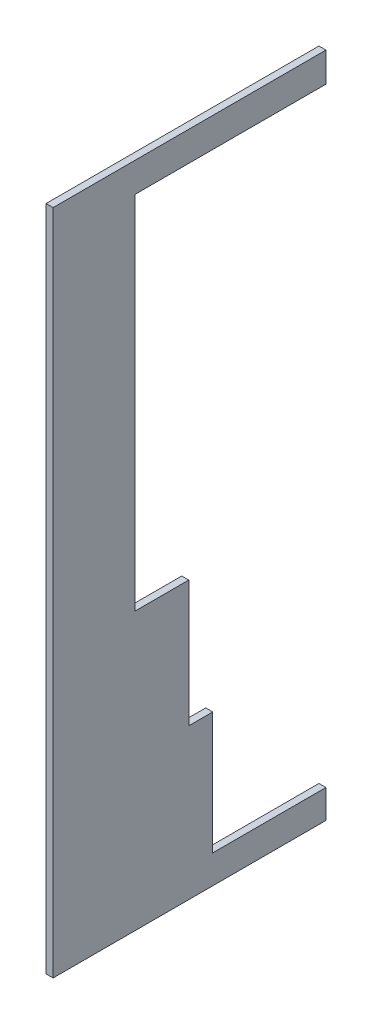
ISO-10303-21;
HEADER;
FILE_DESCRIPTION(('STEP AP214'),'2;1');
FILE_NAME('part.step','',(''),(''),'','','');
FILE_SCHEMA(('AUTOMOTIVE_DESIGN { 1 0 10303 214 1 1 1 1 }'));
ENDSEC;
DATA;
#1=APPLICATION_CONTEXT('core data for automotive mechanical design processes');
#2=APPLICATION_PROTOCOL_DEFINITION('international standard','automotive_design',2000,#1);
#3=PRODUCT_CONTEXT('',#1,'mechanical');
#4=PRODUCT('Part','Part','',(#3));
#5=PRODUCT_RELATED_PRODUCT_CATEGORY('part','',(#4));
#6=PRODUCT_DEFINITION_FORMATION('','',#4);
#7=PRODUCT_DEFINITION_CONTEXT('part definition',#1,'design');
#8=PRODUCT_DEFINITION('design','',#6,#7);
#9=PRODUCT_DEFINITION_SHAPE('','',#8);
#10=(LENGTH_UNIT() NAMED_UNIT(*) SI_UNIT(.MILLI.,.METRE.));
#11=(NAMED_UNIT(*) PLANE_ANGLE_UNIT() SI_UNIT($,.RADIAN.));
#12=(NAMED_UNIT(*) SI_UNIT($,.STERADIAN.) SOLID_ANGLE_UNIT());
#13=UNCERTAINTY_MEASURE_WITH_UNIT(LENGTH_MEASURE(1.E-05),#10,'distance_accuracy_value','');
#14=(GEOMETRIC_REPRESENTATION_CONTEXT(3) GLOBAL_UNCERTAINTY_ASSIGNED_CONTEXT((#13)) GLOBAL_UNIT_ASSIGNED_CONTEXT((#10,
#11,#12)) REPRESENTATION_CONTEXT('',''));
#15=CARTESIAN_POINT('',(0.,0.,0.));
#16=DIRECTION('',(0.,0.,1.));
#17=DIRECTION('',(1.,0.,0.));
#18=AXIS2_PLACEMENT_3D('',#15,#16,#17);
#19=CARTESIAN_POINT('',(1.,100.85,3.40000000000002));
#20=DIRECTION('',(0.,0.,-1.));
#21=DIRECTION('',(0.,1.,0.));
#22=AXIS2_PLACEMENT_3D('',#19,#20,#21);
#23=PLANE('',#22);
#24=DIRECTION('',(1.,0.,0.));
#25=VECTOR('',#24,1.);
#26=CARTESIAN_POINT('',(1.,96.6421958739952,3.40000000000002));
#27=LINE('',#26,#25);
#28=CARTESIAN_POINT('',(0.,96.6421958739952,3.40000000000002));
#29=VERTEX_POINT('',#28);
#30=CARTESIAN_POINT('',(1.,96.6421958739952,3.40000000000002));
#31=VERTEX_POINT('',#30);
#32=EDGE_CURVE('E182',#29,#31,#27,.T.);
#33=ORIENTED_EDGE('',*,*,#32,.F.);
#34=DIRECTION('',(0.,-1.,0.));
#35=VECTOR('',#34,1.);
#36=CARTESIAN_POINT('',(0.,5.85000000000011,3.40000000000002));
#37=LINE('',#36,#35);
#38=CARTESIAN_POINT('',(0.,100.85,3.40000000000002));
#39=VERTEX_POINT('',#38);
#40=EDGE_CURVE('E191',#39,#29,#37,.T.);
#41=ORIENTED_EDGE('',*,*,#40,.F.);
#42=DIRECTION('',(-1.,0.,0.));
#43=VECTOR('',#42,1.);
#44=CARTESIAN_POINT('',(1.,100.85,3.40000000000002));
#45=LINE('',#44,#43);
#46=CARTESIAN_POINT('',(1.,100.85,3.40000000000002));
#47=VERTEX_POINT('',#46);
#48=EDGE_CURVE('E211',#47,#39,#45,.T.);
#49=ORIENTED_EDGE('',*,*,#48,.F.);
#50=DIRECTION('',(0.,-1.,0.));
#51=VECTOR('',#50,1.);
#52=CARTESIAN_POINT('',(1.,100.85,3.40000000000002));
#53=LINE('',#52,#51);
#54=EDGE_CURVE('E206',#47,#31,#53,.T.);
#55=ORIENTED_EDGE('',*,*,#54,.T.);
#56=EDGE_LOOP('',(#33,#41,#49,#55));
#57=FACE_BOUND('',#56,.T.);
#58=ADVANCED_FACE('F34',(#57),#23,.T.);
#59=CARTESIAN_POINT('',(1.,5.85000000000011,3.40000000000003));
#60=DIRECTION('',(0.,-1.,0.));
#61=DIRECTION('',(0.,0.,-1.));
#62=AXIS2_PLACEMENT_3D('',#59,#60,#61);
#63=PLANE('',#62);
#64=DIRECTION('',(-1.,0.,0.));
#65=VECTOR('',#64,1.);
#66=CARTESIAN_POINT('',(1.,5.85000000000012,42.25));
#67=LINE('',#66,#65);
#68=CARTESIAN_POINT('',(1.,5.85000000000012,42.25));
#69=VERTEX_POINT('',#68);
#70=CARTESIAN_POINT('',(0.,5.85000000000012,42.25));
#71=VERTEX_POINT('',#70);
#72=EDGE_CURVE('E209',#69,#71,#67,.T.);
#73=ORIENTED_EDGE('',*,*,#72,.T.);
#74=DIRECTION('',(0.,0.,1.));
#75=VECTOR('',#74,1.);
#76=CARTESIAN_POINT('',(0.,5.85000000000012,42.25));
#77=LINE('',#76,#75);
#78=CARTESIAN_POINT('',(0.,5.85000000000011,3.40000000000002));
#79=VERTEX_POINT('',#78);
#80=EDGE_CURVE('E194',#79,#71,#77,.T.);
#81=ORIENTED_EDGE('',*,*,#80,.F.);
#82=DIRECTION('',(-1.,0.,0.));
#83=VECTOR('',#82,1.);
#84=CARTESIAN_POINT('',(1.,5.85000000000011,3.40000000000003));
#85=LINE('',#84,#83);
#86=CARTESIAN_POINT('',(1.,5.85000000000011,3.40000000000003));
#87=VERTEX_POINT('',#86);
#88=EDGE_CURVE('E42',#87,#79,#85,.T.);
#89=ORIENTED_EDGE('',*,*,#88,.F.);
#90=DIRECTION('',(0.,0.,1.));
#91=VECTOR('',#90,1.);
#92=CARTESIAN_POINT('',(1.,5.85000000000011,3.40000000000003));
#93=LINE('',#92,#91);
#94=EDGE_CURVE('E197',#87,#69,#93,.T.);
#95=ORIENTED_EDGE('',*,*,#94,.T.);
#96=EDGE_LOOP('',(#73,#81,#89,#95));
#97=FACE_BOUND('',#96,.T.);
#98=ADVANCED_FACE('F36',(#97),#63,.T.);
#99=DIRECTION('',(-1.,0.,0.));
#100=VECTOR('',#99,1.);
#101=CARTESIAN_POINT('',(1.,9.9165798371664,3.40000000000003));
#102=LINE('',#101,#100);
#103=CARTESIAN_POINT('',(1.,9.9165798371664,3.40000000000002));
#104=VERTEX_POINT('',#103);
#105=CARTESIAN_POINT('',(0.,9.9165798371664,3.40000000000002));
#106=VERTEX_POINT('',#105);
#107=EDGE_CURVE('E49',#104,#106,#102,.T.);
#108=ORIENTED_EDGE('',*,*,#107,.F.);
#109=EDGE_CURVE('E55',#104,#87,#53,.T.);
#110=ORIENTED_EDGE('',*,*,#109,.T.);
#111=ORIENTED_EDGE('',*,*,#88,.T.);
#112=EDGE_CURVE('E190',#106,#79,#37,.T.);
#113=ORIENTED_EDGE('',*,*,#112,.F.);
#114=EDGE_LOOP('',(#108,#110,#111,#113));
#115=FACE_BOUND('',#114,.T.);
#116=ADVANCED_FACE('F250',(#115),#23,.T.);
#117=CARTESIAN_POINT('',(1.,100.85,42.25));
#118=DIRECTION('',(0.,1.,0.));
#119=DIRECTION('',(0.,0.,1.));
#120=AXIS2_PLACEMENT_3D('',#117,#118,#119);
#121=PLANE('',#120);
#122=ORIENTED_EDGE('',*,*,#48,.T.);
#123=DIRECTION('',(0.,0.,-1.));
#124=VECTOR('',#123,1.);
#125=CARTESIAN_POINT('',(0.,100.85,3.40000000000002));
#126=LINE('',#125,#124);
#127=CARTESIAN_POINT('',(0.,100.85,42.25));
#128=VERTEX_POINT('',#127);
#129=EDGE_CURVE('E187',#128,#39,#126,.T.);
#130=ORIENTED_EDGE('',*,*,#129,.F.);
#131=DIRECTION('',(-1.,0.,0.));
#132=VECTOR('',#131,1.);
#133=CARTESIAN_POINT('',(1.,100.85,42.25));
#134=LINE('',#133,#132);
#135=CARTESIAN_POINT('',(1.,100.85,42.25));
#136=VERTEX_POINT('',#135);
#137=EDGE_CURVE('E213',#136,#128,#134,.T.);
#138=ORIENTED_EDGE('',*,*,#137,.F.);
#139=DIRECTION('',(0.,0.,-1.));
#140=VECTOR('',#139,1.);
#141=CARTESIAN_POINT('',(1.,100.85,42.25));
#142=LINE('',#141,#140);
#143=EDGE_CURVE('E203',#136,#47,#142,.T.);
#144=ORIENTED_EDGE('',*,*,#143,.T.);
#145=EDGE_LOOP('',(#122,#130,#138,#144));
#146=FACE_BOUND('',#145,.T.);
#147=ADVANCED_FACE('F226',(#146),#121,.T.);
#148=CARTESIAN_POINT('',(1.,5.85000000000012,42.25));
#149=DIRECTION('',(0.,0.,1.));
#150=DIRECTION('',(0.,-1.,0.));
#151=AXIS2_PLACEMENT_3D('',#148,#149,#150);
#152=PLANE('',#151);
#153=ORIENTED_EDGE('',*,*,#137,.T.);
#154=DIRECTION('',(0.,1.,0.));
#155=VECTOR('',#154,1.);
#156=CARTESIAN_POINT('',(0.,100.85,42.25));
#157=LINE('',#156,#155);
#158=EDGE_CURVE('E184',#71,#128,#157,.T.);
#159=ORIENTED_EDGE('',*,*,#158,.F.);
#160=ORIENTED_EDGE('',*,*,#72,.F.);
#161=DIRECTION('',(0.,1.,0.));
#162=VECTOR('',#161,1.);
#163=CARTESIAN_POINT('',(1.,5.85000000000012,42.25));
#164=LINE('',#163,#162);
#165=EDGE_CURVE('E200',#69,#136,#164,.T.);
#166=ORIENTED_EDGE('',*,*,#165,.T.);
#167=EDGE_LOOP('',(#153,#159,#160,#166));
#168=FACE_BOUND('',#167,.T.);
#169=ADVANCED_FACE('F222',(#168),#152,.T.);
#170=CARTESIAN_POINT('',(1.,0.,0.));
#171=DIRECTION('',(-1.,0.,0.));
#172=DIRECTION('',(0.,0.,1.));
#173=AXIS2_PLACEMENT_3D('',#170,#171,#172);
#174=PLANE('',#173);
#175=DIRECTION('',(0.,1.,0.));
#176=VECTOR('',#175,1.);
#177=CARTESIAN_POINT('',(1.,45.2626424971357,30.5963033955489));
#178=LINE('',#177,#176);
#179=CARTESIAN_POINT('',(1.,45.2626424971357,30.5963033955489));
#180=VERTEX_POINT('',#179);
#181=CARTESIAN_POINT('',(1.,96.6421958739952,30.5963033955489));
#182=VERTEX_POINT('',#181);
#183=EDGE_CURVE('E155',#180,#182,#178,.T.);
#184=ORIENTED_EDGE('',*,*,#183,.T.);
#185=DIRECTION('',(0.,0.,-1.));
#186=VECTOR('',#185,1.);
#187=CARTESIAN_POINT('',(1.,96.6421958739952,-2.73527842760514));
#188=LINE('',#187,#186);
#189=EDGE_CURVE('E130',#182,#31,#188,.T.);
#190=ORIENTED_EDGE('',*,*,#189,.T.);
#191=ORIENTED_EDGE('',*,*,#54,.F.);
#192=ORIENTED_EDGE('',*,*,#143,.F.);
#193=ORIENTED_EDGE('',*,*,#165,.F.);
#194=ORIENTED_EDGE('',*,*,#94,.F.);
#195=ORIENTED_EDGE('',*,*,#109,.F.);
#196=DIRECTION('',(0.,0.,1.));
#197=VECTOR('',#196,1.);
#198=CARTESIAN_POINT('',(1.,9.9165798371664,19.5203733361027));
#199=LINE('',#198,#197);
#200=CARTESIAN_POINT('',(1.,9.9165798371664,19.5203733361027));
#201=VERTEX_POINT('',#200);
#202=EDGE_CURVE('E125',#104,#201,#199,.T.);
#203=ORIENTED_EDGE('',*,*,#202,.T.);
#204=DIRECTION('',(0.,1.,0.));
#205=VECTOR('',#204,1.);
#206=CARTESIAN_POINT('',(1.,27.2903050278298,19.5203733361027));
#207=LINE('',#206,#205);
#208=CARTESIAN_POINT('',(1.,27.2903050278298,19.5203733361027));
#209=VERTEX_POINT('',#208);
#210=EDGE_CURVE('E133',#201,#209,#207,.T.);
#211=ORIENTED_EDGE('',*,*,#210,.T.);
#212=DIRECTION('',(0.,0.,1.));
#213=VECTOR('',#212,1.);
#214=CARTESIAN_POINT('',(1.,27.2903050278298,22.9258597326259));
#215=LINE('',#214,#213);
#216=CARTESIAN_POINT('',(1.,27.2903050278298,22.9258597326259));
#217=VERTEX_POINT('',#216);
#218=EDGE_CURVE('E138',#209,#217,#215,.T.);
#219=ORIENTED_EDGE('',*,*,#218,.T.);
#220=DIRECTION('',(0.,1.,0.));
#221=VECTOR('',#220,1.);
#222=CARTESIAN_POINT('',(1.,45.2626424971357,22.9258597326259));
#223=LINE('',#222,#221);
#224=CARTESIAN_POINT('',(1.,45.2626424971357,22.9258597326259));
#225=VERTEX_POINT('',#224);
#226=EDGE_CURVE('E149',#217,#225,#223,.T.);
#227=ORIENTED_EDGE('',*,*,#226,.T.);
#228=DIRECTION('',(0.,0.,1.));
#229=VECTOR('',#228,1.);
#230=CARTESIAN_POINT('',(1.,45.2626424971357,30.5963033955489));
#231=LINE('',#230,#229);
#232=EDGE_CURVE('E152',#225,#180,#231,.T.);
#233=ORIENTED_EDGE('',*,*,#232,.T.);
#234=EDGE_LOOP('',(#184,#190,#191,#192,#193,#194,#195,#203,#211,#219,#227,#233));
#235=FACE_BOUND('',#234,.T.);
#236=ADVANCED_FACE('F141',(#235),#174,.F.);
#237=CARTESIAN_POINT('',(0.,0.,0.));
#238=DIRECTION('',(1.,0.,0.));
#239=DIRECTION('',(0.,0.,-1.));
#240=AXIS2_PLACEMENT_3D('',#237,#238,#239);
#241=PLANE('',#240);
#242=ORIENTED_EDGE('',*,*,#40,.T.);
#243=DIRECTION('',(0.,0.,-1.));
#244=VECTOR('',#243,1.);
#245=CARTESIAN_POINT('',(0.,96.6421958739952,-2.73527842760514));
#246=LINE('',#245,#244);
#247=CARTESIAN_POINT('',(0.,96.6421958739952,30.5963033955489));
#248=VERTEX_POINT('',#247);
#249=EDGE_CURVE('E143',#248,#29,#246,.T.);
#250=ORIENTED_EDGE('',*,*,#249,.F.);
#251=DIRECTION('',(0.,1.,0.));
#252=VECTOR('',#251,1.);
#253=CARTESIAN_POINT('',(0.,45.2626424971357,30.5963033955489));
#254=LINE('',#253,#252);
#255=CARTESIAN_POINT('',(0.,45.2626424971357,30.5963033955489));
#256=VERTEX_POINT('',#255);
#257=EDGE_CURVE('E145',#256,#248,#254,.T.);
#258=ORIENTED_EDGE('',*,*,#257,.F.);
#259=DIRECTION('',(0.,0.,1.));
#260=VECTOR('',#259,1.);
#261=CARTESIAN_POINT('',(0.,45.2626424971357,30.5963033955489));
#262=LINE('',#261,#260);
#263=CARTESIAN_POINT('',(0.,45.2626424971357,22.9258597326259));
#264=VERTEX_POINT('',#263);
#265=EDGE_CURVE('E167',#264,#256,#262,.T.);
#266=ORIENTED_EDGE('',*,*,#265,.F.);
#267=DIRECTION('',(0.,1.,0.));
#268=VECTOR('',#267,1.);
#269=CARTESIAN_POINT('',(0.,45.2626424971357,22.9258597326259));
#270=LINE('',#269,#268);
#271=CARTESIAN_POINT('',(0.,27.2903050278298,22.9258597326259));
#272=VERTEX_POINT('',#271);
#273=EDGE_CURVE('E164',#272,#264,#270,.T.);
#274=ORIENTED_EDGE('',*,*,#273,.F.);
#275=DIRECTION('',(0.,0.,1.));
#276=VECTOR('',#275,1.);
#277=CARTESIAN_POINT('',(0.,27.2903050278298,22.9258597326259));
#278=LINE('',#277,#276);
#279=CARTESIAN_POINT('',(0.,27.2903050278298,19.5203733361027));
#280=VERTEX_POINT('',#279);
#281=EDGE_CURVE('E161',#280,#272,#278,.T.);
#282=ORIENTED_EDGE('',*,*,#281,.F.);
#283=DIRECTION('',(0.,1.,0.));
#284=VECTOR('',#283,1.);
#285=CARTESIAN_POINT('',(0.,27.2903050278298,19.5203733361027));
#286=LINE('',#285,#284);
#287=CARTESIAN_POINT('',(0.,9.9165798371664,19.5203733361027));
#288=VERTEX_POINT('',#287);
#289=EDGE_CURVE('E159',#288,#280,#286,.T.);
#290=ORIENTED_EDGE('',*,*,#289,.F.);
#291=DIRECTION('',(0.,0.,-1.));
#292=VECTOR('',#291,1.);
#293=CARTESIAN_POINT('',(0.,9.9165798371664,0.));
#294=LINE('',#293,#292);
#295=EDGE_CURVE('E11',#288,#106,#294,.T.);
#296=ORIENTED_EDGE('',*,*,#295,.T.);
#297=ORIENTED_EDGE('',*,*,#112,.T.);
#298=ORIENTED_EDGE('',*,*,#80,.T.);
#299=ORIENTED_EDGE('',*,*,#158,.T.);
#300=ORIENTED_EDGE('',*,*,#129,.T.);
#301=EDGE_LOOP('',(#242,#250,#258,#266,#274,#282,#290,#296,#297,#298,#299,#300));
#302=FACE_BOUND('',#301,.T.);
#303=ADVANCED_FACE('F220',(#302),#241,.F.);
#304=CARTESIAN_POINT('',(1.,96.6421958739952,-2.73527842760514));
#305=DIRECTION('',(0.,1.,0.));
#306=DIRECTION('',(0.,0.,1.));
#307=AXIS2_PLACEMENT_3D('',#304,#305,#306);
#308=PLANE('',#307);
#309=ORIENTED_EDGE('',*,*,#32,.T.);
#310=ORIENTED_EDGE('',*,*,#189,.F.);
#311=DIRECTION('',(-1.,0.,0.));
#312=VECTOR('',#311,1.);
#313=CARTESIAN_POINT('',(1.,96.6421958739952,30.5963033955489));
#314=LINE('',#313,#312);
#315=EDGE_CURVE('E172',#182,#248,#314,.T.);
#316=ORIENTED_EDGE('',*,*,#315,.T.);
#317=ORIENTED_EDGE('',*,*,#249,.T.);
#318=EDGE_LOOP('',(#309,#310,#316,#317));
#319=FACE_BOUND('',#318,.T.);
#320=ADVANCED_FACE('F234',(#319),#308,.F.);
#321=CARTESIAN_POINT('',(1.,45.2626424971357,30.5963033955489));
#322=DIRECTION('',(0.,0.,1.));
#323=DIRECTION('',(1.,0.,0.));
#324=AXIS2_PLACEMENT_3D('',#321,#322,#323);
#325=PLANE('',#324);
#326=ORIENTED_EDGE('',*,*,#257,.T.);
#327=ORIENTED_EDGE('',*,*,#315,.F.);
#328=ORIENTED_EDGE('',*,*,#183,.F.);
#329=DIRECTION('',(-1.,0.,0.));
#330=VECTOR('',#329,1.);
#331=CARTESIAN_POINT('',(1.,45.2626424971357,30.5963033955489));
#332=LINE('',#331,#330);
#333=EDGE_CURVE('E174',#180,#256,#332,.T.);
#334=ORIENTED_EDGE('',*,*,#333,.T.);
#335=EDGE_LOOP('',(#326,#327,#328,#334));
#336=FACE_BOUND('',#335,.T.);
#337=ADVANCED_FACE('F238',(#336),#325,.F.);
#338=CARTESIAN_POINT('',(1.,45.2626424971357,30.5963033955489));
#339=DIRECTION('',(0.,-1.,0.));
#340=DIRECTION('',(0.,0.,-1.));
#341=AXIS2_PLACEMENT_3D('',#338,#339,#340);
#342=PLANE('',#341);
#343=ORIENTED_EDGE('',*,*,#265,.T.);
#344=ORIENTED_EDGE('',*,*,#333,.F.);
#345=ORIENTED_EDGE('',*,*,#232,.F.);
#346=DIRECTION('',(-1.,0.,0.));
#347=VECTOR('',#346,1.);
#348=CARTESIAN_POINT('',(1.,45.2626424971357,22.9258597326259));
#349=LINE('',#348,#347);
#350=EDGE_CURVE('E176',#225,#264,#349,.T.);
#351=ORIENTED_EDGE('',*,*,#350,.T.);
#352=EDGE_LOOP('',(#343,#344,#345,#351));
#353=FACE_BOUND('',#352,.T.);
#354=ADVANCED_FACE('F244',(#353),#342,.F.);
#355=CARTESIAN_POINT('',(1.,45.2626424971357,22.9258597326259));
#356=DIRECTION('',(0.,0.,1.));
#357=DIRECTION('',(0.,-1.,0.));
#358=AXIS2_PLACEMENT_3D('',#355,#356,#357);
#359=PLANE('',#358);
#360=ORIENTED_EDGE('',*,*,#273,.T.);
#361=ORIENTED_EDGE('',*,*,#350,.F.);
#362=ORIENTED_EDGE('',*,*,#226,.F.);
#363=DIRECTION('',(-1.,0.,0.));
#364=VECTOR('',#363,1.);
#365=CARTESIAN_POINT('',(1.,27.2903050278298,22.9258597326259));
#366=LINE('',#365,#364);
#367=EDGE_CURVE('E178',#217,#272,#366,.T.);
#368=ORIENTED_EDGE('',*,*,#367,.T.);
#369=EDGE_LOOP('',(#360,#361,#362,#368));
#370=FACE_BOUND('',#369,.T.);
#371=ADVANCED_FACE('F247',(#370),#359,.F.);
#372=CARTESIAN_POINT('',(1.,27.2903050278298,22.9258597326259));
#373=DIRECTION('',(0.,-1.,0.));
#374=DIRECTION('',(0.,0.,-1.));
#375=AXIS2_PLACEMENT_3D('',#372,#373,#374);
#376=PLANE('',#375);
#377=ORIENTED_EDGE('',*,*,#281,.T.);
#378=ORIENTED_EDGE('',*,*,#367,.F.);
#379=ORIENTED_EDGE('',*,*,#218,.F.);
#380=DIRECTION('',(-1.,0.,0.));
#381=VECTOR('',#380,1.);
#382=CARTESIAN_POINT('',(1.,27.2903050278298,19.5203733361027));
#383=LINE('',#382,#381);
#384=EDGE_CURVE('E129',#209,#280,#383,.T.);
#385=ORIENTED_EDGE('',*,*,#384,.T.);
#386=EDGE_LOOP('',(#377,#378,#379,#385));
#387=FACE_BOUND('',#386,.T.);
#388=ADVANCED_FACE('F249',(#387),#376,.F.);
#389=CARTESIAN_POINT('',(1.,27.2903050278298,19.5203733361027));
#390=DIRECTION('',(0.,0.,1.));
#391=DIRECTION('',(1.,0.,0.));
#392=AXIS2_PLACEMENT_3D('',#389,#390,#391);
#393=PLANE('',#392);
#394=ORIENTED_EDGE('',*,*,#289,.T.);
#395=ORIENTED_EDGE('',*,*,#384,.F.);
#396=ORIENTED_EDGE('',*,*,#210,.F.);
#397=DIRECTION('',(-1.,0.,0.));
#398=VECTOR('',#397,1.);
#399=CARTESIAN_POINT('',(1.,9.9165798371664,19.5203733361027));
#400=LINE('',#399,#398);
#401=EDGE_CURVE('E121',#201,#288,#400,.T.);
#402=ORIENTED_EDGE('',*,*,#401,.T.);
#403=EDGE_LOOP('',(#394,#395,#396,#402));
#404=FACE_BOUND('',#403,.T.);
#405=ADVANCED_FACE('F134',(#404),#393,.F.);
#406=CARTESIAN_POINT('',(1.,9.9165798371664,19.5203733361027));
#407=DIRECTION('',(0.,-1.,0.));
#408=DIRECTION('',(0.,0.,-1.));
#409=AXIS2_PLACEMENT_3D('',#406,#407,#408);
#410=PLANE('',#409);
#411=ORIENTED_EDGE('',*,*,#107,.T.);
#412=ORIENTED_EDGE('',*,*,#295,.F.);
#413=ORIENTED_EDGE('',*,*,#401,.F.);
#414=ORIENTED_EDGE('',*,*,#202,.F.);
#415=EDGE_LOOP('',(#411,#412,#413,#414));
#416=FACE_BOUND('',#415,.T.);
#417=ADVANCED_FACE('F123',(#416),#410,.F.);
#418=CLOSED_SHELL('',(#58,#98,#116,#147,#169,#236,#303,#320,#337,#354,#371,#388,#405,#417));
#419=MANIFOLD_SOLID_BREP('B2',#418);
#420=ADVANCED_BREP_SHAPE_REPRESENTATION('',(#18,#419),#14);
#421=SHAPE_DEFINITION_REPRESENTATION(#9,#420);
ENDSEC;
END-ISO-10303-21;
